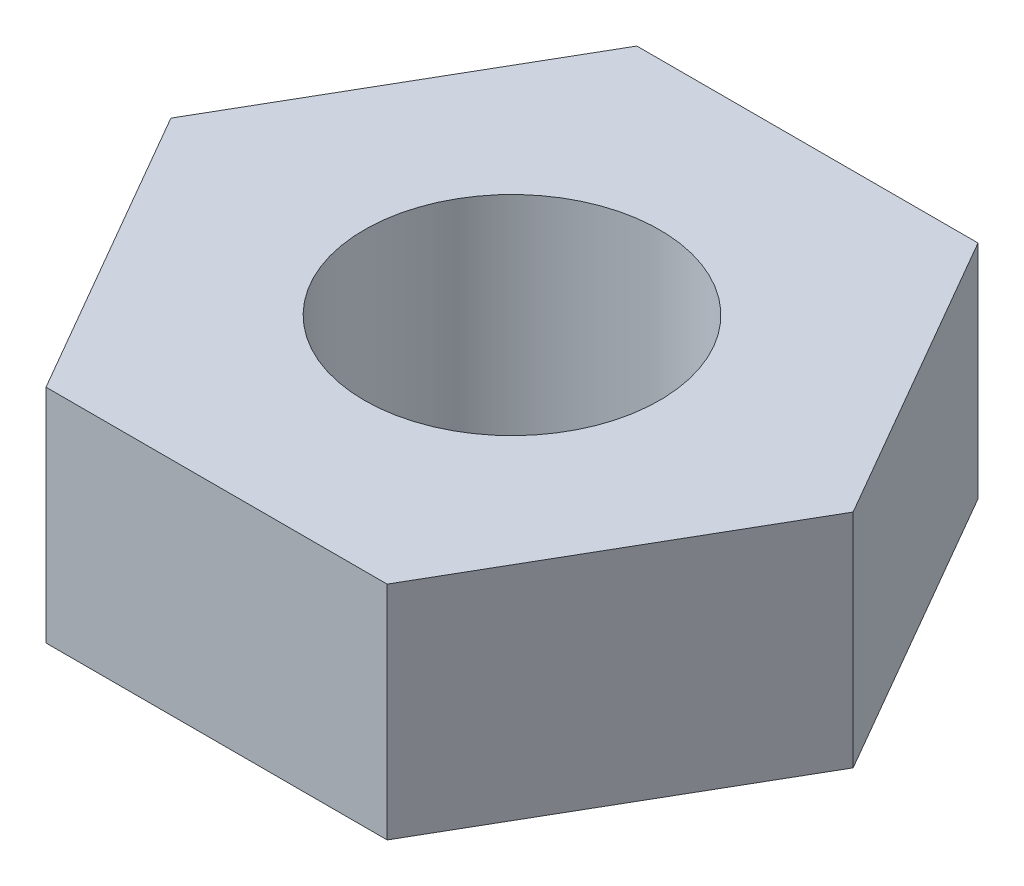
ISO-10303-21;
HEADER;
FILE_DESCRIPTION(('STEP AP214'),'2;1');
FILE_NAME('part.step','',(''),(''),'','','');
FILE_SCHEMA(('AUTOMOTIVE_DESIGN { 1 0 10303 214 1 1 1 1 }'));
ENDSEC;
DATA;
#1=APPLICATION_CONTEXT('core data for automotive mechanical design processes');
#2=APPLICATION_PROTOCOL_DEFINITION('international standard','automotive_design',2000,#1);
#3=PRODUCT_CONTEXT('',#1,'mechanical');
#4=PRODUCT('Part','Part','',(#3));
#5=PRODUCT_RELATED_PRODUCT_CATEGORY('part','',(#4));
#6=PRODUCT_DEFINITION_FORMATION('','',#4);
#7=PRODUCT_DEFINITION_CONTEXT('part definition',#1,'design');
#8=PRODUCT_DEFINITION('design','',#6,#7);
#9=PRODUCT_DEFINITION_SHAPE('','',#8);
#10=(LENGTH_UNIT() NAMED_UNIT(*) SI_UNIT(.MILLI.,.METRE.));
#11=(NAMED_UNIT(*) PLANE_ANGLE_UNIT() SI_UNIT($,.RADIAN.));
#12=(NAMED_UNIT(*) SI_UNIT($,.STERADIAN.) SOLID_ANGLE_UNIT());
#13=UNCERTAINTY_MEASURE_WITH_UNIT(LENGTH_MEASURE(1.E-05),#10,'distance_accuracy_value','');
#14=(GEOMETRIC_REPRESENTATION_CONTEXT(3) GLOBAL_UNCERTAINTY_ASSIGNED_CONTEXT((#13)) GLOBAL_UNIT_ASSIGNED_CONTEXT((#10,
#11,#12)) REPRESENTATION_CONTEXT('',''));
#15=CARTESIAN_POINT('',(0.,0.,0.));
#16=DIRECTION('',(0.,0.,1.));
#17=DIRECTION('',(1.,0.,0.));
#18=AXIS2_PLACEMENT_3D('',#15,#16,#17);
#19=CARTESIAN_POINT('',(0.,3.,0.));
#20=DIRECTION('',(0.,1.,0.));
#21=DIRECTION('',(0.,0.,1.));
#22=AXIS2_PLACEMENT_3D('',#19,#20,#21);
#23=PLANE('',#22);
#24=DIRECTION('',(-0.499999999999995,0.,0.866025403784442));
#25=VECTOR('',#24,1.);
#26=CARTESIAN_POINT('',(-2.30940107675855,3.,-3.99999999999997));
#27=LINE('',#26,#25);
#28=CARTESIAN_POINT('',(-2.30940107675855,3.,-3.99999999999997));
#29=VERTEX_POINT('',#28);
#30=CARTESIAN_POINT('',(-4.61880215351701,3.,0.));
#31=VERTEX_POINT('',#30);
#32=EDGE_CURVE('E128',#29,#31,#27,.T.);
#33=ORIENTED_EDGE('',*,*,#32,.T.);
#34=DIRECTION('',(0.500000000000001,0.,0.866025403784438));
#35=VECTOR('',#34,1.);
#36=CARTESIAN_POINT('',(-4.61880215351701,3.,0.));
#37=LINE('',#36,#35);
#38=CARTESIAN_POINT('',(-2.30940107675849,3.,4.00000000000001));
#39=VERTEX_POINT('',#38);
#40=EDGE_CURVE('E86',#31,#39,#37,.T.);
#41=ORIENTED_EDGE('',*,*,#40,.T.);
#42=DIRECTION('',(1.,0.,0.));
#43=VECTOR('',#42,1.);
#44=CARTESIAN_POINT('',(-2.30940107675849,3.,4.00000000000001));
#45=LINE('',#44,#43);
#46=CARTESIAN_POINT('',(2.30940107675852,3.,3.99999999999999));
#47=VERTEX_POINT('',#46);
#48=EDGE_CURVE('E99',#39,#47,#45,.T.);
#49=ORIENTED_EDGE('',*,*,#48,.T.);
#50=DIRECTION('',(0.499999999999995,0.,-0.866025403784441));
#51=VECTOR('',#50,1.);
#52=CARTESIAN_POINT('',(2.30940107675852,3.,3.99999999999999));
#53=LINE('',#52,#51);
#54=CARTESIAN_POINT('',(4.61880215351701,3.,0.));
#55=VERTEX_POINT('',#54);
#56=EDGE_CURVE('E93',#47,#55,#53,.T.);
#57=ORIENTED_EDGE('',*,*,#56,.T.);
#58=DIRECTION('',(-0.500000000000007,0.,-0.866025403784435));
#59=VECTOR('',#58,1.);
#60=CARTESIAN_POINT('',(4.61880215351701,3.,0.));
#61=LINE('',#60,#59);
#62=CARTESIAN_POINT('',(2.30940107675847,3.,-4.00000000000002));
#63=VERTEX_POINT('',#62);
#64=EDGE_CURVE('E97',#55,#63,#61,.T.);
#65=ORIENTED_EDGE('',*,*,#64,.T.);
#66=DIRECTION('',(-1.,0.,0.));
#67=VECTOR('',#66,1.);
#68=CARTESIAN_POINT('',(2.30940107675847,3.,-4.00000000000002));
#69=LINE('',#68,#67);
#70=EDGE_CURVE('E49',#63,#29,#69,.T.);
#71=ORIENTED_EDGE('',*,*,#70,.T.);
#72=EDGE_LOOP('',(#33,#41,#49,#57,#65,#71));
#73=FACE_BOUND('',#72,.T.);
#74=CARTESIAN_POINT('',(0.,3.,0.));
#75=DIRECTION('',(0.,1.,0.));
#76=DIRECTION('',(0.,0.,1.));
#77=AXIS2_PLACEMENT_3D('',#74,#75,#76);
#78=CIRCLE('',#77,2.);
#79=CARTESIAN_POINT('',(0.,3.,2.));
#80=VERTEX_POINT('',#79);
#81=EDGE_CURVE('E121',#80,#80,#78,.T.);
#82=ORIENTED_EDGE('',*,*,#81,.F.);
#83=EDGE_LOOP('',(#82));
#84=FACE_BOUND('',#83,.T.);
#85=ADVANCED_FACE('F32',(#73,#84),#23,.T.);
#86=CARTESIAN_POINT('',(0.,0.,0.));
#87=DIRECTION('',(0.,1.,0.));
#88=DIRECTION('',(0.,0.,1.));
#89=AXIS2_PLACEMENT_3D('',#86,#87,#88);
#90=PLANE('',#89);
#91=DIRECTION('',(-0.499999999999995,0.,0.866025403784442));
#92=VECTOR('',#91,1.);
#93=CARTESIAN_POINT('',(-2.30940107675855,0.,-3.99999999999997));
#94=LINE('',#93,#92);
#95=CARTESIAN_POINT('',(-2.30940107675855,0.,-3.99999999999997));
#96=VERTEX_POINT('',#95);
#97=CARTESIAN_POINT('',(-4.61880215351701,0.,0.));
#98=VERTEX_POINT('',#97);
#99=EDGE_CURVE('E117',#96,#98,#94,.T.);
#100=ORIENTED_EDGE('',*,*,#99,.F.);
#101=DIRECTION('',(-1.,0.,0.));
#102=VECTOR('',#101,1.);
#103=CARTESIAN_POINT('',(2.30940107675847,0.,-4.00000000000002));
#104=LINE('',#103,#102);
#105=CARTESIAN_POINT('',(2.30940107675847,0.,-4.00000000000002));
#106=VERTEX_POINT('',#105);
#107=EDGE_CURVE('E78',#106,#96,#104,.T.);
#108=ORIENTED_EDGE('',*,*,#107,.F.);
#109=DIRECTION('',(-0.500000000000007,0.,-0.866025403784435));
#110=VECTOR('',#109,1.);
#111=CARTESIAN_POINT('',(4.61880215351701,0.,0.));
#112=LINE('',#111,#110);
#113=CARTESIAN_POINT('',(4.61880215351701,0.,0.));
#114=VERTEX_POINT('',#113);
#115=EDGE_CURVE('E72',#114,#106,#112,.T.);
#116=ORIENTED_EDGE('',*,*,#115,.F.);
#117=DIRECTION('',(0.499999999999995,0.,-0.866025403784441));
#118=VECTOR('',#117,1.);
#119=CARTESIAN_POINT('',(2.30940107675852,0.,3.99999999999999));
#120=LINE('',#119,#118);
#121=CARTESIAN_POINT('',(2.30940107675852,0.,3.99999999999999));
#122=VERTEX_POINT('',#121);
#123=EDGE_CURVE('E107',#122,#114,#120,.T.);
#124=ORIENTED_EDGE('',*,*,#123,.F.);
#125=DIRECTION('',(1.,0.,0.));
#126=VECTOR('',#125,1.);
#127=CARTESIAN_POINT('',(-2.30940107675849,0.,4.00000000000001));
#128=LINE('',#127,#126);
#129=CARTESIAN_POINT('',(-2.30940107675849,0.,4.00000000000001));
#130=VERTEX_POINT('',#129);
#131=EDGE_CURVE('E123',#130,#122,#128,.T.);
#132=ORIENTED_EDGE('',*,*,#131,.F.);
#133=DIRECTION('',(0.500000000000001,0.,0.866025403784438));
#134=VECTOR('',#133,1.);
#135=CARTESIAN_POINT('',(-4.61880215351701,0.,0.));
#136=LINE('',#135,#134);
#137=EDGE_CURVE('E120',#98,#130,#136,.T.);
#138=ORIENTED_EDGE('',*,*,#137,.F.);
#139=EDGE_LOOP('',(#100,#108,#116,#124,#132,#138));
#140=FACE_BOUND('',#139,.T.);
#141=CARTESIAN_POINT('',(0.,0.,0.));
#142=DIRECTION('',(0.,1.,0.));
#143=DIRECTION('',(0.,0.,1.));
#144=AXIS2_PLACEMENT_3D('',#141,#142,#143);
#145=CIRCLE('',#144,2.);
#146=CARTESIAN_POINT('',(0.,0.,2.));
#147=VERTEX_POINT('',#146);
#148=EDGE_CURVE('E221',#147,#147,#145,.T.);
#149=ORIENTED_EDGE('',*,*,#148,.T.);
#150=EDGE_LOOP('',(#149));
#151=FACE_BOUND('',#150,.T.);
#152=ADVANCED_FACE('F137',(#140,#151),#90,.F.);
#153=CARTESIAN_POINT('',(-2.30940107675855,3.,-3.99999999999997));
#154=DIRECTION('',(0.866025403784441,0.,0.499999999999995));
#155=DIRECTION('',(0.499999999999995,0.,-0.866025403784442));
#156=AXIS2_PLACEMENT_3D('',#153,#154,#155);
#157=PLANE('',#156);
#158=ORIENTED_EDGE('',*,*,#99,.T.);
#159=DIRECTION('',(0.,-1.,0.));
#160=VECTOR('',#159,1.);
#161=CARTESIAN_POINT('',(-4.61880215351701,3.,0.));
#162=LINE('',#161,#160);
#163=EDGE_CURVE('E11',#31,#98,#162,.T.);
#164=ORIENTED_EDGE('',*,*,#163,.F.);
#165=ORIENTED_EDGE('',*,*,#32,.F.);
#166=DIRECTION('',(0.,-1.,0.));
#167=VECTOR('',#166,1.);
#168=CARTESIAN_POINT('',(-2.30940107675855,3.,-3.99999999999997));
#169=LINE('',#168,#167);
#170=EDGE_CURVE('E113',#29,#96,#169,.T.);
#171=ORIENTED_EDGE('',*,*,#170,.T.);
#172=EDGE_LOOP('',(#158,#164,#165,#171));
#173=FACE_BOUND('',#172,.T.);
#174=ADVANCED_FACE('F34',(#173),#157,.F.);
#175=CARTESIAN_POINT('',(-4.61880215351701,3.,0.));
#176=DIRECTION('',(0.866025403784438,0.,-0.500000000000001));
#177=DIRECTION('',(-0.500000000000001,0.,-0.866025403784438));
#178=AXIS2_PLACEMENT_3D('',#175,#176,#177);
#179=PLANE('',#178);
#180=ORIENTED_EDGE('',*,*,#137,.T.);
#181=DIRECTION('',(0.,-1.,0.));
#182=VECTOR('',#181,1.);
#183=CARTESIAN_POINT('',(-2.30940107675849,3.,4.00000000000001));
#184=LINE('',#183,#182);
#185=EDGE_CURVE('E41',#39,#130,#184,.T.);
#186=ORIENTED_EDGE('',*,*,#185,.F.);
#187=ORIENTED_EDGE('',*,*,#40,.F.);
#188=ORIENTED_EDGE('',*,*,#163,.T.);
#189=EDGE_LOOP('',(#180,#186,#187,#188));
#190=FACE_BOUND('',#189,.T.);
#191=ADVANCED_FACE('F162',(#190),#179,.F.);
#192=CARTESIAN_POINT('',(-2.30940107675849,3.,4.00000000000001));
#193=DIRECTION('',(0.,0.,-1.));
#194=DIRECTION('',(-1.,0.,0.));
#195=AXIS2_PLACEMENT_3D('',#192,#193,#194);
#196=PLANE('',#195);
#197=ORIENTED_EDGE('',*,*,#131,.T.);
#198=DIRECTION('',(0.,-1.,0.));
#199=VECTOR('',#198,1.);
#200=CARTESIAN_POINT('',(2.30940107675852,3.,3.99999999999999));
#201=LINE('',#200,#199);
#202=EDGE_CURVE('E108',#47,#122,#201,.T.);
#203=ORIENTED_EDGE('',*,*,#202,.F.);
#204=ORIENTED_EDGE('',*,*,#48,.F.);
#205=ORIENTED_EDGE('',*,*,#185,.T.);
#206=EDGE_LOOP('',(#197,#203,#204,#205));
#207=FACE_BOUND('',#206,.T.);
#208=ADVANCED_FACE('F134',(#207),#196,.F.);
#209=CARTESIAN_POINT('',(2.30940107675852,3.,3.99999999999999));
#210=DIRECTION('',(-0.866025403784441,0.,-0.499999999999995));
#211=DIRECTION('',(-0.499999999999995,0.,0.866025403784441));
#212=AXIS2_PLACEMENT_3D('',#209,#210,#211);
#213=PLANE('',#212);
#214=ORIENTED_EDGE('',*,*,#123,.T.);
#215=DIRECTION('',(0.,-1.,0.));
#216=VECTOR('',#215,1.);
#217=CARTESIAN_POINT('',(4.61880215351701,3.,0.));
#218=LINE('',#217,#216);
#219=EDGE_CURVE('E104',#55,#114,#218,.T.);
#220=ORIENTED_EDGE('',*,*,#219,.F.);
#221=ORIENTED_EDGE('',*,*,#56,.F.);
#222=ORIENTED_EDGE('',*,*,#202,.T.);
#223=EDGE_LOOP('',(#214,#220,#221,#222));
#224=FACE_BOUND('',#223,.T.);
#225=ADVANCED_FACE('F105',(#224),#213,.F.);
#226=CARTESIAN_POINT('',(4.61880215351701,3.,0.));
#227=DIRECTION('',(-0.866025403784434,0.,0.500000000000007));
#228=DIRECTION('',(0.500000000000007,0.,0.866025403784435));
#229=AXIS2_PLACEMENT_3D('',#226,#227,#228);
#230=PLANE('',#229);
#231=ORIENTED_EDGE('',*,*,#115,.T.);
#232=DIRECTION('',(0.,-1.,0.));
#233=VECTOR('',#232,1.);
#234=CARTESIAN_POINT('',(2.30940107675847,3.,-4.00000000000002));
#235=LINE('',#234,#233);
#236=EDGE_CURVE('E109',#63,#106,#235,.T.);
#237=ORIENTED_EDGE('',*,*,#236,.F.);
#238=ORIENTED_EDGE('',*,*,#64,.F.);
#239=ORIENTED_EDGE('',*,*,#219,.T.);
#240=EDGE_LOOP('',(#231,#237,#238,#239));
#241=FACE_BOUND('',#240,.T.);
#242=ADVANCED_FACE('F111',(#241),#230,.F.);
#243=CARTESIAN_POINT('',(2.30940107675847,3.,-4.00000000000002));
#244=DIRECTION('',(0.,0.,1.));
#245=DIRECTION('',(1.,0.,0.));
#246=AXIS2_PLACEMENT_3D('',#243,#244,#245);
#247=PLANE('',#246);
#248=ORIENTED_EDGE('',*,*,#107,.T.);
#249=ORIENTED_EDGE('',*,*,#170,.F.);
#250=ORIENTED_EDGE('',*,*,#70,.F.);
#251=ORIENTED_EDGE('',*,*,#236,.T.);
#252=EDGE_LOOP('',(#248,#249,#250,#251));
#253=FACE_BOUND('',#252,.T.);
#254=ADVANCED_FACE('F142',(#253),#247,.F.);
#255=CARTESIAN_POINT('',(0.,3.,0.));
#256=DIRECTION('',(0.,-1.,0.));
#257=DIRECTION('',(0.,0.,-1.));
#258=AXIS2_PLACEMENT_3D('',#255,#256,#257);
#259=CYLINDRICAL_SURFACE('',#258,2.);
#260=ORIENTED_EDGE('',*,*,#81,.T.);
#261=EDGE_LOOP('',(#260));
#262=FACE_BOUND('',#261,.T.);
#263=ORIENTED_EDGE('',*,*,#148,.F.);
#264=EDGE_LOOP('',(#263));
#265=FACE_BOUND('',#264,.T.);
#266=ADVANCED_FACE('F144',(#262,#265),#259,.F.);
#267=CLOSED_SHELL('',(#85,#152,#174,#191,#208,#225,#242,#254,#266));
#268=MANIFOLD_SOLID_BREP('B2',#267);
#269=ADVANCED_BREP_SHAPE_REPRESENTATION('',(#18,#268),#14);
#270=SHAPE_DEFINITION_REPRESENTATION(#9,#269);
ENDSEC;
END-ISO-10303-21;
